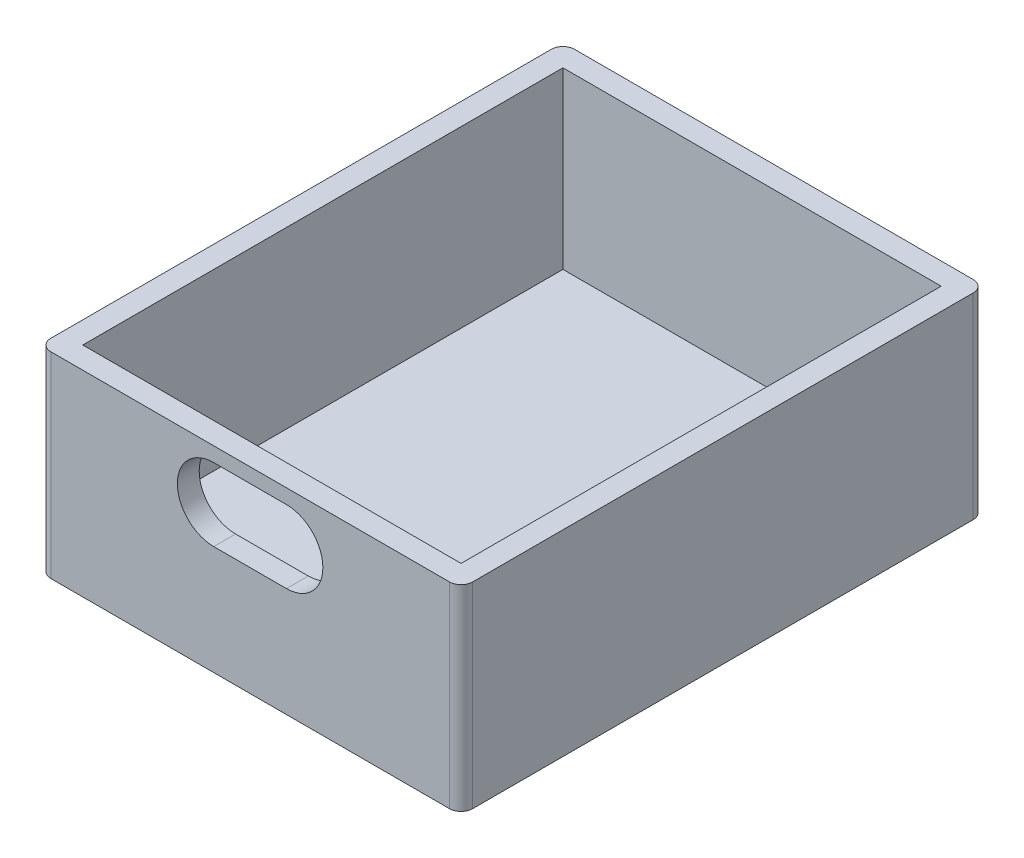
ISO-10303-21;
HEADER;
FILE_DESCRIPTION(('STEP AP214'),'2;1');
FILE_NAME('part.step','',(''),(''),'','','');
FILE_SCHEMA(('AUTOMOTIVE_DESIGN { 1 0 10303 214 1 1 1 1 }'));
ENDSEC;
DATA;
#1=APPLICATION_CONTEXT('core data for automotive mechanical design processes');
#2=APPLICATION_PROTOCOL_DEFINITION('international standard','automotive_design',2000,#1);
#3=PRODUCT_CONTEXT('',#1,'mechanical');
#4=PRODUCT('Part','Part','',(#3));
#5=PRODUCT_RELATED_PRODUCT_CATEGORY('part','',(#4));
#6=PRODUCT_DEFINITION_FORMATION('','',#4);
#7=PRODUCT_DEFINITION_CONTEXT('part definition',#1,'design');
#8=PRODUCT_DEFINITION('design','',#6,#7);
#9=PRODUCT_DEFINITION_SHAPE('','',#8);
#10=(LENGTH_UNIT() NAMED_UNIT(*) SI_UNIT(.MILLI.,.METRE.));
#11=(NAMED_UNIT(*) PLANE_ANGLE_UNIT() SI_UNIT($,.RADIAN.));
#12=(NAMED_UNIT(*) SI_UNIT($,.STERADIAN.) SOLID_ANGLE_UNIT());
#13=UNCERTAINTY_MEASURE_WITH_UNIT(LENGTH_MEASURE(1.E-05),#10,'distance_accuracy_value','');
#14=(GEOMETRIC_REPRESENTATION_CONTEXT(3) GLOBAL_UNCERTAINTY_ASSIGNED_CONTEXT((#13)) GLOBAL_UNIT_ASSIGNED_CONTEXT((#10,
#11,#12)) REPRESENTATION_CONTEXT('',''));
#15=CARTESIAN_POINT('',(0.,0.,0.));
#16=DIRECTION('',(0.,0.,1.));
#17=DIRECTION('',(1.,0.,0.));
#18=AXIS2_PLACEMENT_3D('',#15,#16,#17);
#19=CARTESIAN_POINT('',(0.,0.,36.));
#20=DIRECTION('',(1.,0.,0.));
#21=DIRECTION('',(0.,1.,0.));
#22=AXIS2_PLACEMENT_3D('',#19,#20,#21);
#23=PLANE('',#22);
#24=DIRECTION('',(0.,0.,-1.));
#25=VECTOR('',#24,1.);
#26=CARTESIAN_POINT('',(0.,-13.5,36.));
#27=LINE('',#26,#25);
#28=CARTESIAN_POINT('',(0.,-13.5,35.2));
#29=VERTEX_POINT('',#28);
#30=CARTESIAN_POINT('',(0.,-13.5,0.800000000000002));
#31=VERTEX_POINT('',#30);
#32=EDGE_CURVE('E238',#29,#31,#27,.T.);
#33=ORIENTED_EDGE('',*,*,#32,.F.);
#34=DIRECTION('',(0.,-1.,0.));
#35=VECTOR('',#34,1.);
#36=CARTESIAN_POINT('',(0.,0.,35.2));
#37=LINE('',#36,#35);
#38=CARTESIAN_POINT('',(0.,0.,35.2));
#39=VERTEX_POINT('',#38);
#40=EDGE_CURVE('E258',#29,#39,#37,.F.);
#41=ORIENTED_EDGE('',*,*,#40,.T.);
#42=DIRECTION('',(0.,0.,-1.));
#43=VECTOR('',#42,1.);
#44=CARTESIAN_POINT('',(0.,0.,36.));
#45=LINE('',#44,#43);
#46=CARTESIAN_POINT('',(0.,0.,0.800000000000002));
#47=VERTEX_POINT('',#46);
#48=EDGE_CURVE('E226',#39,#47,#45,.T.);
#49=ORIENTED_EDGE('',*,*,#48,.T.);
#50=DIRECTION('',(0.,-1.,0.));
#51=VECTOR('',#50,1.);
#52=CARTESIAN_POINT('',(0.,0.,0.800000000000002));
#53=LINE('',#52,#51);
#54=EDGE_CURVE('E255',#47,#31,#53,.T.);
#55=ORIENTED_EDGE('',*,*,#54,.T.);
#56=EDGE_LOOP('',(#33,#41,#49,#55));
#57=FACE_BOUND('',#56,.T.);
#58=ADVANCED_FACE('F34',(#57),#23,.F.);
#59=CARTESIAN_POINT('',(0.,-13.5,36.));
#60=DIRECTION('',(0.,1.,0.));
#61=DIRECTION('',(0.,0.,1.));
#62=AXIS2_PLACEMENT_3D('',#59,#60,#61);
#63=PLANE('',#62);
#64=DIRECTION('',(1.,0.,0.));
#65=VECTOR('',#64,1.);
#66=CARTESIAN_POINT('',(0.,-13.5,36.));
#67=LINE('',#66,#65);
#68=CARTESIAN_POINT('',(0.800000000000003,-13.5,36.));
#69=VERTEX_POINT('',#68);
#70=CARTESIAN_POINT('',(28.2,-13.5,36.));
#71=VERTEX_POINT('',#70);
#72=EDGE_CURVE('E219',#69,#71,#67,.T.);
#73=ORIENTED_EDGE('',*,*,#72,.F.);
#74=CARTESIAN_POINT('',(0.800000000000003,-13.5,35.2));
#75=DIRECTION('',(0.,1.,0.));
#76=DIRECTION('',(0.,0.,1.));
#77=AXIS2_PLACEMENT_3D('',#74,#75,#76);
#78=CIRCLE('',#77,0.8);
#79=EDGE_CURVE('E253',#69,#29,#78,.F.);
#80=ORIENTED_EDGE('',*,*,#79,.T.);
#81=ORIENTED_EDGE('',*,*,#32,.T.);
#82=CARTESIAN_POINT('',(0.800000000000003,-13.5,0.800000000000002));
#83=DIRECTION('',(0.,1.,0.));
#84=DIRECTION('',(0.,0.,1.));
#85=AXIS2_PLACEMENT_3D('',#82,#83,#84);
#86=CIRCLE('',#85,0.8);
#87=CARTESIAN_POINT('',(0.800000000000003,-13.5,0.));
#88=VERTEX_POINT('',#87);
#89=EDGE_CURVE('E251',#31,#88,#86,.F.);
#90=ORIENTED_EDGE('',*,*,#89,.T.);
#91=DIRECTION('',(1.,0.,0.));
#92=VECTOR('',#91,1.);
#93=CARTESIAN_POINT('',(0.,-13.5,0.));
#94=LINE('',#93,#92);
#95=CARTESIAN_POINT('',(28.2,-13.5,0.));
#96=VERTEX_POINT('',#95);
#97=EDGE_CURVE('E212',#88,#96,#94,.T.);
#98=ORIENTED_EDGE('',*,*,#97,.T.);
#99=CARTESIAN_POINT('',(28.2,-13.5,0.800000000000002));
#100=DIRECTION('',(0.,1.,0.));
#101=DIRECTION('',(0.,0.,1.));
#102=AXIS2_PLACEMENT_3D('',#99,#100,#101);
#103=CIRCLE('',#102,0.8);
#104=CARTESIAN_POINT('',(29.,-13.5,0.800000000000002));
#105=VERTEX_POINT('',#104);
#106=EDGE_CURVE('E249',#96,#105,#103,.F.);
#107=ORIENTED_EDGE('',*,*,#106,.T.);
#108=DIRECTION('',(0.,0.,-1.));
#109=VECTOR('',#108,1.);
#110=CARTESIAN_POINT('',(29.,-13.5,36.));
#111=LINE('',#110,#109);
#112=CARTESIAN_POINT('',(29.,-13.5,35.2));
#113=VERTEX_POINT('',#112);
#114=EDGE_CURVE('E235',#113,#105,#111,.T.);
#115=ORIENTED_EDGE('',*,*,#114,.F.);
#116=CARTESIAN_POINT('',(28.2,-13.5,35.2));
#117=DIRECTION('',(0.,1.,0.));
#118=DIRECTION('',(0.,0.,1.));
#119=AXIS2_PLACEMENT_3D('',#116,#117,#118);
#120=CIRCLE('',#119,0.8);
#121=EDGE_CURVE('E247',#113,#71,#120,.F.);
#122=ORIENTED_EDGE('',*,*,#121,.T.);
#123=EDGE_LOOP('',(#73,#80,#81,#90,#98,#107,#115,#122));
#124=FACE_BOUND('',#123,.T.);
#125=ADVANCED_FACE('F277',(#124),#63,.F.);
#126=CARTESIAN_POINT('',(29.,0.,36.));
#127=DIRECTION('',(-1.,0.,0.));
#128=DIRECTION('',(0.,-1.,0.));
#129=AXIS2_PLACEMENT_3D('',#126,#127,#128);
#130=PLANE('',#129);
#131=ORIENTED_EDGE('',*,*,#114,.T.);
#132=DIRECTION('',(0.,1.,0.));
#133=VECTOR('',#132,1.);
#134=CARTESIAN_POINT('',(29.,0.,0.800000000000002));
#135=LINE('',#134,#133);
#136=CARTESIAN_POINT('',(29.,0.,0.800000000000002));
#137=VERTEX_POINT('',#136);
#138=EDGE_CURVE('E11',#105,#137,#135,.T.);
#139=ORIENTED_EDGE('',*,*,#138,.T.);
#140=DIRECTION('',(0.,0.,-1.));
#141=VECTOR('',#140,1.);
#142=CARTESIAN_POINT('',(29.,0.,36.));
#143=LINE('',#142,#141);
#144=CARTESIAN_POINT('',(29.,0.,35.2));
#145=VERTEX_POINT('',#144);
#146=EDGE_CURVE('E233',#145,#137,#143,.T.);
#147=ORIENTED_EDGE('',*,*,#146,.F.);
#148=DIRECTION('',(0.,1.,0.));
#149=VECTOR('',#148,1.);
#150=CARTESIAN_POINT('',(29.,-13.5,35.2));
#151=LINE('',#150,#149);
#152=EDGE_CURVE('E42',#145,#113,#151,.F.);
#153=ORIENTED_EDGE('',*,*,#152,.T.);
#154=EDGE_LOOP('',(#131,#139,#147,#153));
#155=FACE_BOUND('',#154,.T.);
#156=ADVANCED_FACE('F272',(#155),#130,.F.);
#157=CARTESIAN_POINT('',(0.,0.,36.));
#158=DIRECTION('',(0.,-1.,0.));
#159=DIRECTION('',(0.,0.,-1.));
#160=AXIS2_PLACEMENT_3D('',#157,#158,#159);
#161=PLANE('',#160);
#162=DIRECTION('',(1.,0.,0.));
#163=VECTOR('',#162,1.);
#164=CARTESIAN_POINT('',(1.5,0.,34.5));
#165=LINE('',#164,#163);
#166=CARTESIAN_POINT('',(1.5,0.,34.5));
#167=VERTEX_POINT('',#166);
#168=CARTESIAN_POINT('',(27.5,0.,34.5));
#169=VERTEX_POINT('',#168);
#170=EDGE_CURVE('E202',#167,#169,#165,.T.);
#171=ORIENTED_EDGE('',*,*,#170,.F.);
#172=DIRECTION('',(0.,0.,1.));
#173=VECTOR('',#172,1.);
#174=CARTESIAN_POINT('',(1.5,0.,1.5));
#175=LINE('',#174,#173);
#176=CARTESIAN_POINT('',(1.5,0.,1.5));
#177=VERTEX_POINT('',#176);
#178=EDGE_CURVE('E185',#177,#167,#175,.T.);
#179=ORIENTED_EDGE('',*,*,#178,.F.);
#180=DIRECTION('',(-1.,0.,0.));
#181=VECTOR('',#180,1.);
#182=CARTESIAN_POINT('',(1.5,0.,1.5));
#183=LINE('',#182,#181);
#184=CARTESIAN_POINT('',(27.5,0.,1.5));
#185=VERTEX_POINT('',#184);
#186=EDGE_CURVE('E191',#185,#177,#183,.T.);
#187=ORIENTED_EDGE('',*,*,#186,.F.);
#188=DIRECTION('',(0.,0.,-1.));
#189=VECTOR('',#188,1.);
#190=CARTESIAN_POINT('',(27.5,0.,1.5));
#191=LINE('',#190,#189);
#192=EDGE_CURVE('E205',#169,#185,#191,.T.);
#193=ORIENTED_EDGE('',*,*,#192,.F.);
#194=EDGE_LOOP('',(#171,#179,#187,#193));
#195=FACE_BOUND('',#194,.T.);
#196=ORIENTED_EDGE('',*,*,#48,.F.);
#197=CARTESIAN_POINT('',(0.8,0.,35.2));
#198=DIRECTION('',(0.,-1.,0.));
#199=DIRECTION('',(0.,0.,-1.));
#200=AXIS2_PLACEMENT_3D('',#197,#198,#199);
#201=CIRCLE('',#200,0.8);
#202=CARTESIAN_POINT('',(0.8,0.,36.));
#203=VERTEX_POINT('',#202);
#204=EDGE_CURVE('E264',#39,#203,#201,.F.);
#205=ORIENTED_EDGE('',*,*,#204,.T.);
#206=DIRECTION('',(-1.,0.,0.));
#207=VECTOR('',#206,1.);
#208=CARTESIAN_POINT('',(0.,0.,36.));
#209=LINE('',#208,#207);
#210=CARTESIAN_POINT('',(28.2,0.,36.));
#211=VERTEX_POINT('',#210);
#212=EDGE_CURVE('E222',#211,#203,#209,.T.);
#213=ORIENTED_EDGE('',*,*,#212,.F.);
#214=CARTESIAN_POINT('',(28.2,0.,35.2));
#215=DIRECTION('',(0.,-1.,0.));
#216=DIRECTION('',(0.,0.,-1.));
#217=AXIS2_PLACEMENT_3D('',#214,#215,#216);
#218=CIRCLE('',#217,0.8);
#219=EDGE_CURVE('E56',#211,#145,#218,.F.);
#220=ORIENTED_EDGE('',*,*,#219,.T.);
#221=ORIENTED_EDGE('',*,*,#146,.T.);
#222=CARTESIAN_POINT('',(28.2,0.,0.800000000000002));
#223=DIRECTION('',(0.,-1.,0.));
#224=DIRECTION('',(0.,0.,-1.));
#225=AXIS2_PLACEMENT_3D('',#222,#223,#224);
#226=CIRCLE('',#225,0.8);
#227=CARTESIAN_POINT('',(28.2,0.,0.));
#228=VERTEX_POINT('',#227);
#229=EDGE_CURVE('E49',#137,#228,#226,.F.);
#230=ORIENTED_EDGE('',*,*,#229,.T.);
#231=DIRECTION('',(-1.,0.,0.));
#232=VECTOR('',#231,1.);
#233=CARTESIAN_POINT('',(0.,0.,0.));
#234=LINE('',#233,#232);
#235=CARTESIAN_POINT('',(0.8,0.,0.));
#236=VERTEX_POINT('',#235);
#237=EDGE_CURVE('E223',#228,#236,#234,.T.);
#238=ORIENTED_EDGE('',*,*,#237,.T.);
#239=CARTESIAN_POINT('',(0.8,0.,0.800000000000002));
#240=DIRECTION('',(0.,-1.,0.));
#241=DIRECTION('',(0.,0.,-1.));
#242=AXIS2_PLACEMENT_3D('',#239,#240,#241);
#243=CIRCLE('',#242,0.8);
#244=EDGE_CURVE('E262',#236,#47,#243,.F.);
#245=ORIENTED_EDGE('',*,*,#244,.T.);
#246=EDGE_LOOP('',(#196,#205,#213,#220,#221,#230,#238,#245));
#247=FACE_BOUND('',#246,.T.);
#248=ADVANCED_FACE('F282',(#195,#247),#161,.F.);
#249=CARTESIAN_POINT('',(0.,0.,36.));
#250=DIRECTION('',(0.,0.,1.));
#251=DIRECTION('',(1.,0.,0.));
#252=AXIS2_PLACEMENT_3D('',#249,#250,#251);
#253=PLANE('',#252);
#254=DIRECTION('',(1.,0.,0.));
#255=VECTOR('',#254,1.);
#256=CARTESIAN_POINT('',(12.,-6.,36.));
#257=LINE('',#256,#255);
#258=CARTESIAN_POINT('',(12.,-6.,36.));
#259=VERTEX_POINT('',#258);
#260=CARTESIAN_POINT('',(17.,-6.,36.));
#261=VERTEX_POINT('',#260);
#262=EDGE_CURVE('E169',#259,#261,#257,.T.);
#263=ORIENTED_EDGE('',*,*,#262,.F.);
#264=CARTESIAN_POINT('',(12.,-3.5,36.));
#265=DIRECTION('',(0.,0.,-1.));
#266=DIRECTION('',(-1.,0.,0.));
#267=AXIS2_PLACEMENT_3D('',#264,#265,#266);
#268=CIRCLE('',#267,2.5);
#269=CARTESIAN_POINT('',(12.,-1.,36.));
#270=VERTEX_POINT('',#269);
#271=EDGE_CURVE('E174',#259,#270,#268,.T.);
#272=ORIENTED_EDGE('',*,*,#271,.T.);
#273=DIRECTION('',(1.,0.,0.));
#274=VECTOR('',#273,1.);
#275=CARTESIAN_POINT('',(12.,-1.,36.));
#276=LINE('',#275,#274);
#277=CARTESIAN_POINT('',(17.,-1.,36.));
#278=VERTEX_POINT('',#277);
#279=EDGE_CURVE('E153',#270,#278,#276,.T.);
#280=ORIENTED_EDGE('',*,*,#279,.T.);
#281=CARTESIAN_POINT('',(17.,-3.5,36.));
#282=DIRECTION('',(0.,0.,1.));
#283=DIRECTION('',(1.,0.,0.));
#284=AXIS2_PLACEMENT_3D('',#281,#282,#283);
#285=CIRCLE('',#284,2.5);
#286=EDGE_CURVE('E164',#261,#278,#285,.T.);
#287=ORIENTED_EDGE('',*,*,#286,.F.);
#288=EDGE_LOOP('',(#263,#272,#280,#287));
#289=FACE_BOUND('',#288,.T.);
#290=ORIENTED_EDGE('',*,*,#212,.T.);
#291=DIRECTION('',(0.,-1.,0.));
#292=VECTOR('',#291,1.);
#293=CARTESIAN_POINT('',(0.800000000000003,-13.5,36.));
#294=LINE('',#293,#292);
#295=EDGE_CURVE('E244',#203,#69,#294,.T.);
#296=ORIENTED_EDGE('',*,*,#295,.T.);
#297=ORIENTED_EDGE('',*,*,#72,.T.);
#298=DIRECTION('',(0.,1.,0.));
#299=VECTOR('',#298,1.);
#300=CARTESIAN_POINT('',(28.2,0.,36.));
#301=LINE('',#300,#299);
#302=EDGE_CURVE('E241',#71,#211,#301,.T.);
#303=ORIENTED_EDGE('',*,*,#302,.T.);
#304=EDGE_LOOP('',(#290,#296,#297,#303));
#305=FACE_BOUND('',#304,.T.);
#306=ADVANCED_FACE('F171',(#289,#305),#253,.T.);
#307=CARTESIAN_POINT('',(0.,0.,0.));
#308=DIRECTION('',(0.,0.,1.));
#309=DIRECTION('',(1.,0.,0.));
#310=AXIS2_PLACEMENT_3D('',#307,#308,#309);
#311=PLANE('',#310);
#312=ORIENTED_EDGE('',*,*,#97,.F.);
#313=DIRECTION('',(0.,-1.,0.));
#314=VECTOR('',#313,1.);
#315=CARTESIAN_POINT('',(0.8,0.,0.));
#316=LINE('',#315,#314);
#317=EDGE_CURVE('E268',#88,#236,#316,.F.);
#318=ORIENTED_EDGE('',*,*,#317,.T.);
#319=ORIENTED_EDGE('',*,*,#237,.F.);
#320=DIRECTION('',(0.,1.,0.));
#321=VECTOR('',#320,1.);
#322=CARTESIAN_POINT('',(28.2,0.,0.));
#323=LINE('',#322,#321);
#324=EDGE_CURVE('E266',#228,#96,#323,.F.);
#325=ORIENTED_EDGE('',*,*,#324,.T.);
#326=EDGE_LOOP('',(#312,#318,#319,#325));
#327=FACE_BOUND('',#326,.T.);
#328=ADVANCED_FACE('F296',(#327),#311,.F.);
#329=CARTESIAN_POINT('',(1.5,-12.,1.5));
#330=DIRECTION('',(-1.,0.,0.));
#331=DIRECTION('',(0.,0.,1.));
#332=AXIS2_PLACEMENT_3D('',#329,#330,#331);
#333=PLANE('',#332);
#334=ORIENTED_EDGE('',*,*,#178,.T.);
#335=DIRECTION('',(0.,1.,0.));
#336=VECTOR('',#335,1.);
#337=CARTESIAN_POINT('',(1.5,-12.,34.5));
#338=LINE('',#337,#336);
#339=CARTESIAN_POINT('',(1.5,-12.,34.5));
#340=VERTEX_POINT('',#339);
#341=EDGE_CURVE('E200',#340,#167,#338,.T.);
#342=ORIENTED_EDGE('',*,*,#341,.F.);
#343=DIRECTION('',(0.,0.,1.));
#344=VECTOR('',#343,1.);
#345=CARTESIAN_POINT('',(1.5,-12.,1.5));
#346=LINE('',#345,#344);
#347=CARTESIAN_POINT('',(1.5,-12.,1.5));
#348=VERTEX_POINT('',#347);
#349=EDGE_CURVE('E187',#348,#340,#346,.T.);
#350=ORIENTED_EDGE('',*,*,#349,.F.);
#351=DIRECTION('',(0.,1.,0.));
#352=VECTOR('',#351,1.);
#353=CARTESIAN_POINT('',(1.5,-12.,1.5));
#354=LINE('',#353,#352);
#355=EDGE_CURVE('E210',#348,#177,#354,.T.);
#356=ORIENTED_EDGE('',*,*,#355,.T.);
#357=EDGE_LOOP('',(#334,#342,#350,#356));
#358=FACE_BOUND('',#357,.T.);
#359=ADVANCED_FACE('F338',(#358),#333,.F.);
#360=CARTESIAN_POINT('',(1.5,-12.,1.5));
#361=DIRECTION('',(0.,0.,-1.));
#362=DIRECTION('',(-1.,0.,0.));
#363=AXIS2_PLACEMENT_3D('',#360,#361,#362);
#364=PLANE('',#363);
#365=ORIENTED_EDGE('',*,*,#186,.T.);
#366=ORIENTED_EDGE('',*,*,#355,.F.);
#367=DIRECTION('',(-1.,0.,0.));
#368=VECTOR('',#367,1.);
#369=CARTESIAN_POINT('',(1.5,-12.,1.5));
#370=LINE('',#369,#368);
#371=CARTESIAN_POINT('',(27.5,-12.,1.5));
#372=VERTEX_POINT('',#371);
#373=EDGE_CURVE('E197',#372,#348,#370,.T.);
#374=ORIENTED_EDGE('',*,*,#373,.F.);
#375=DIRECTION('',(0.,1.,0.));
#376=VECTOR('',#375,1.);
#377=CARTESIAN_POINT('',(27.5,-12.,1.5));
#378=LINE('',#377,#376);
#379=EDGE_CURVE('E213',#372,#185,#378,.T.);
#380=ORIENTED_EDGE('',*,*,#379,.T.);
#381=EDGE_LOOP('',(#365,#366,#374,#380));
#382=FACE_BOUND('',#381,.T.);
#383=ADVANCED_FACE('F334',(#382),#364,.F.);
#384=CARTESIAN_POINT('',(27.5,-12.,1.5));
#385=DIRECTION('',(1.,0.,0.));
#386=DIRECTION('',(0.,0.,-1.));
#387=AXIS2_PLACEMENT_3D('',#384,#385,#386);
#388=PLANE('',#387);
#389=ORIENTED_EDGE('',*,*,#192,.T.);
#390=ORIENTED_EDGE('',*,*,#379,.F.);
#391=DIRECTION('',(0.,0.,-1.));
#392=VECTOR('',#391,1.);
#393=CARTESIAN_POINT('',(27.5,-12.,1.5));
#394=LINE('',#393,#392);
#395=CARTESIAN_POINT('',(27.5,-12.,34.5));
#396=VERTEX_POINT('',#395);
#397=EDGE_CURVE('E194',#396,#372,#394,.T.);
#398=ORIENTED_EDGE('',*,*,#397,.F.);
#399=DIRECTION('',(0.,1.,0.));
#400=VECTOR('',#399,1.);
#401=CARTESIAN_POINT('',(27.5,-12.,34.5));
#402=LINE('',#401,#400);
#403=EDGE_CURVE('E215',#396,#169,#402,.T.);
#404=ORIENTED_EDGE('',*,*,#403,.T.);
#405=EDGE_LOOP('',(#389,#390,#398,#404));
#406=FACE_BOUND('',#405,.T.);
#407=ADVANCED_FACE('F337',(#406),#388,.F.);
#408=CARTESIAN_POINT('',(1.5,-12.,34.5));
#409=DIRECTION('',(0.,0.,1.));
#410=DIRECTION('',(1.,0.,0.));
#411=AXIS2_PLACEMENT_3D('',#408,#409,#410);
#412=PLANE('',#411);
#413=CARTESIAN_POINT('',(12.,-3.5,34.5));
#414=DIRECTION('',(0.,0.,1.));
#415=DIRECTION('',(1.,0.,0.));
#416=AXIS2_PLACEMENT_3D('',#413,#414,#415);
#417=CIRCLE('',#416,2.5);
#418=CARTESIAN_POINT('',(12.,-1.,34.5));
#419=VERTEX_POINT('',#418);
#420=CARTESIAN_POINT('',(12.,-6.,34.5));
#421=VERTEX_POINT('',#420);
#422=EDGE_CURVE('E466',#419,#421,#417,.T.);
#423=ORIENTED_EDGE('',*,*,#422,.T.);
#424=DIRECTION('',(-1.,0.,0.));
#425=VECTOR('',#424,1.);
#426=CARTESIAN_POINT('',(12.,-6.,34.5));
#427=LINE('',#426,#425);
#428=CARTESIAN_POINT('',(17.,-6.,34.5));
#429=VERTEX_POINT('',#428);
#430=EDGE_CURVE('E186',#429,#421,#427,.T.);
#431=ORIENTED_EDGE('',*,*,#430,.F.);
#432=CARTESIAN_POINT('',(17.,-3.5,34.5));
#433=DIRECTION('',(0.,0.,1.));
#434=DIRECTION('',(1.,0.,0.));
#435=AXIS2_PLACEMENT_3D('',#432,#433,#434);
#436=CIRCLE('',#435,2.5);
#437=CARTESIAN_POINT('',(17.,-1.,34.5));
#438=VERTEX_POINT('',#437);
#439=EDGE_CURVE('E183',#438,#429,#436,.F.);
#440=ORIENTED_EDGE('',*,*,#439,.F.);
#441=DIRECTION('',(-1.,0.,0.));
#442=VECTOR('',#441,1.);
#443=CARTESIAN_POINT('',(12.,-1.,34.5));
#444=LINE('',#443,#442);
#445=EDGE_CURVE('E156',#438,#419,#444,.T.);
#446=ORIENTED_EDGE('',*,*,#445,.T.);
#447=EDGE_LOOP('',(#423,#431,#440,#446));
#448=FACE_BOUND('',#447,.T.);
#449=ORIENTED_EDGE('',*,*,#170,.T.);
#450=ORIENTED_EDGE('',*,*,#403,.F.);
#451=DIRECTION('',(1.,0.,0.));
#452=VECTOR('',#451,1.);
#453=CARTESIAN_POINT('',(1.5,-12.,34.5));
#454=LINE('',#453,#452);
#455=EDGE_CURVE('E190',#340,#396,#454,.T.);
#456=ORIENTED_EDGE('',*,*,#455,.F.);
#457=ORIENTED_EDGE('',*,*,#341,.T.);
#458=EDGE_LOOP('',(#449,#450,#456,#457));
#459=FACE_BOUND('',#458,.T.);
#460=ADVANCED_FACE('F332',(#448,#459),#412,.F.);
#461=CARTESIAN_POINT('',(0.,-12.,0.));
#462=DIRECTION('',(0.,1.,0.));
#463=DIRECTION('',(0.,0.,1.));
#464=AXIS2_PLACEMENT_3D('',#461,#462,#463);
#465=PLANE('',#464);
#466=ORIENTED_EDGE('',*,*,#349,.T.);
#467=ORIENTED_EDGE('',*,*,#455,.T.);
#468=ORIENTED_EDGE('',*,*,#397,.T.);
#469=ORIENTED_EDGE('',*,*,#373,.T.);
#470=EDGE_LOOP('',(#466,#467,#468,#469));
#471=FACE_BOUND('',#470,.T.);
#472=ADVANCED_FACE('F328',(#471),#465,.T.);
#473=CARTESIAN_POINT('',(12.,-6.,23.319660112501));
#474=DIRECTION('',(0.,-1.,0.));
#475=DIRECTION('',(0.,0.,-1.));
#476=AXIS2_PLACEMENT_3D('',#473,#474,#475);
#477=PLANE('',#476);
#478=ORIENTED_EDGE('',*,*,#430,.T.);
#479=DIRECTION('',(0.,0.,1.));
#480=VECTOR('',#479,1.);
#481=CARTESIAN_POINT('',(12.,-6.,23.319660112501));
#482=LINE('',#481,#480);
#483=EDGE_CURVE('E179',#421,#259,#482,.T.);
#484=ORIENTED_EDGE('',*,*,#483,.T.);
#485=ORIENTED_EDGE('',*,*,#262,.T.);
#486=DIRECTION('',(0.,0.,1.));
#487=VECTOR('',#486,1.);
#488=CARTESIAN_POINT('',(17.,-6.,23.319660112501));
#489=LINE('',#488,#487);
#490=EDGE_CURVE('E160',#429,#261,#489,.T.);
#491=ORIENTED_EDGE('',*,*,#490,.F.);
#492=EDGE_LOOP('',(#478,#484,#485,#491));
#493=FACE_BOUND('',#492,.T.);
#494=ADVANCED_FACE('F325',(#493),#477,.F.);
#495=CARTESIAN_POINT('',(12.,-3.5,23.319660112501));
#496=DIRECTION('',(0.,0.,1.));
#497=DIRECTION('',(1.,0.,0.));
#498=AXIS2_PLACEMENT_3D('',#495,#496,#497);
#499=CYLINDRICAL_SURFACE('',#498,2.5);
#500=DIRECTION('',(0.,0.,1.));
#501=VECTOR('',#500,1.);
#502=CARTESIAN_POINT('',(12.,-1.,23.319660112501));
#503=LINE('',#502,#501);
#504=EDGE_CURVE('E159',#419,#270,#503,.T.);
#505=ORIENTED_EDGE('',*,*,#504,.T.);
#506=ORIENTED_EDGE('',*,*,#271,.F.);
#507=ORIENTED_EDGE('',*,*,#483,.F.);
#508=ORIENTED_EDGE('',*,*,#422,.F.);
#509=EDGE_LOOP('',(#505,#506,#507,#508));
#510=FACE_BOUND('',#509,.T.);
#511=ADVANCED_FACE('F321',(#510),#499,.F.);
#512=CARTESIAN_POINT('',(12.,-1.,23.319660112501));
#513=DIRECTION('',(0.,-1.,0.));
#514=DIRECTION('',(0.,0.,-1.));
#515=AXIS2_PLACEMENT_3D('',#512,#513,#514);
#516=PLANE('',#515);
#517=DIRECTION('',(0.,0.,1.));
#518=VECTOR('',#517,1.);
#519=CARTESIAN_POINT('',(17.,-1.,23.319660112501));
#520=LINE('',#519,#518);
#521=EDGE_CURVE('E148',#438,#278,#520,.T.);
#522=ORIENTED_EDGE('',*,*,#521,.T.);
#523=ORIENTED_EDGE('',*,*,#279,.F.);
#524=ORIENTED_EDGE('',*,*,#504,.F.);
#525=ORIENTED_EDGE('',*,*,#445,.F.);
#526=EDGE_LOOP('',(#522,#523,#524,#525));
#527=FACE_BOUND('',#526,.T.);
#528=ADVANCED_FACE('F150',(#527),#516,.T.);
#529=CARTESIAN_POINT('',(17.,-3.5,23.319660112501));
#530=DIRECTION('',(0.,0.,1.));
#531=DIRECTION('',(1.,0.,0.));
#532=AXIS2_PLACEMENT_3D('',#529,#530,#531);
#533=CYLINDRICAL_SURFACE('',#532,2.5);
#534=ORIENTED_EDGE('',*,*,#439,.T.);
#535=ORIENTED_EDGE('',*,*,#490,.T.);
#536=ORIENTED_EDGE('',*,*,#286,.T.);
#537=ORIENTED_EDGE('',*,*,#521,.F.);
#538=EDGE_LOOP('',(#534,#535,#536,#537));
#539=FACE_BOUND('',#538,.T.);
#540=ADVANCED_FACE('F165',(#539),#533,.F.);
#541=CARTESIAN_POINT('',(0.8,0.,35.2));
#542=DIRECTION('',(0.,1.,0.));
#543=DIRECTION('',(-1.,0.,0.));
#544=AXIS2_PLACEMENT_3D('',#541,#542,#543);
#545=CYLINDRICAL_SURFACE('',#544,0.8);
#546=ORIENTED_EDGE('',*,*,#204,.F.);
#547=ORIENTED_EDGE('',*,*,#40,.F.);
#548=ORIENTED_EDGE('',*,*,#79,.F.);
#549=ORIENTED_EDGE('',*,*,#295,.F.);
#550=EDGE_LOOP('',(#546,#547,#548,#549));
#551=FACE_BOUND('',#550,.T.);
#552=ADVANCED_FACE('F286',(#551),#545,.T.);
#553=CARTESIAN_POINT('',(0.8,0.,0.800000000000002));
#554=DIRECTION('',(0.,-1.,0.));
#555=DIRECTION('',(1.,0.,0.));
#556=AXIS2_PLACEMENT_3D('',#553,#554,#555);
#557=CYLINDRICAL_SURFACE('',#556,0.8);
#558=ORIENTED_EDGE('',*,*,#244,.F.);
#559=ORIENTED_EDGE('',*,*,#317,.F.);
#560=ORIENTED_EDGE('',*,*,#89,.F.);
#561=ORIENTED_EDGE('',*,*,#54,.F.);
#562=EDGE_LOOP('',(#558,#559,#560,#561));
#563=FACE_BOUND('',#562,.T.);
#564=ADVANCED_FACE('F292',(#563),#557,.T.);
#565=CARTESIAN_POINT('',(28.2,0.,0.800000000000002));
#566=DIRECTION('',(0.,1.,0.));
#567=DIRECTION('',(-1.,0.,0.));
#568=AXIS2_PLACEMENT_3D('',#565,#566,#567);
#569=CYLINDRICAL_SURFACE('',#568,0.8);
#570=ORIENTED_EDGE('',*,*,#106,.F.);
#571=ORIENTED_EDGE('',*,*,#324,.F.);
#572=ORIENTED_EDGE('',*,*,#229,.F.);
#573=ORIENTED_EDGE('',*,*,#138,.F.);
#574=EDGE_LOOP('',(#570,#571,#572,#573));
#575=FACE_BOUND('',#574,.T.);
#576=ADVANCED_FACE('F298',(#575),#569,.T.);
#577=CARTESIAN_POINT('',(28.2,0.,35.2));
#578=DIRECTION('',(0.,-1.,0.));
#579=DIRECTION('',(1.,0.,0.));
#580=AXIS2_PLACEMENT_3D('',#577,#578,#579);
#581=CYLINDRICAL_SURFACE('',#580,0.8);
#582=ORIENTED_EDGE('',*,*,#121,.F.);
#583=ORIENTED_EDGE('',*,*,#152,.F.);
#584=ORIENTED_EDGE('',*,*,#219,.F.);
#585=ORIENTED_EDGE('',*,*,#302,.F.);
#586=EDGE_LOOP('',(#582,#583,#584,#585));
#587=FACE_BOUND('',#586,.T.);
#588=ADVANCED_FACE('F36',(#587),#581,.T.);
#589=CLOSED_SHELL('',(#58,#125,#156,#248,#306,#328,#359,#383,#407,#460,#472,#494,#511,#528,#540,
#552,#564,#576,#588));
#590=MANIFOLD_SOLID_BREP('B2',#589);
#591=ADVANCED_BREP_SHAPE_REPRESENTATION('',(#18,#590),#14);
#592=SHAPE_DEFINITION_REPRESENTATION(#9,#591);
ENDSEC;
END-ISO-10303-21;
